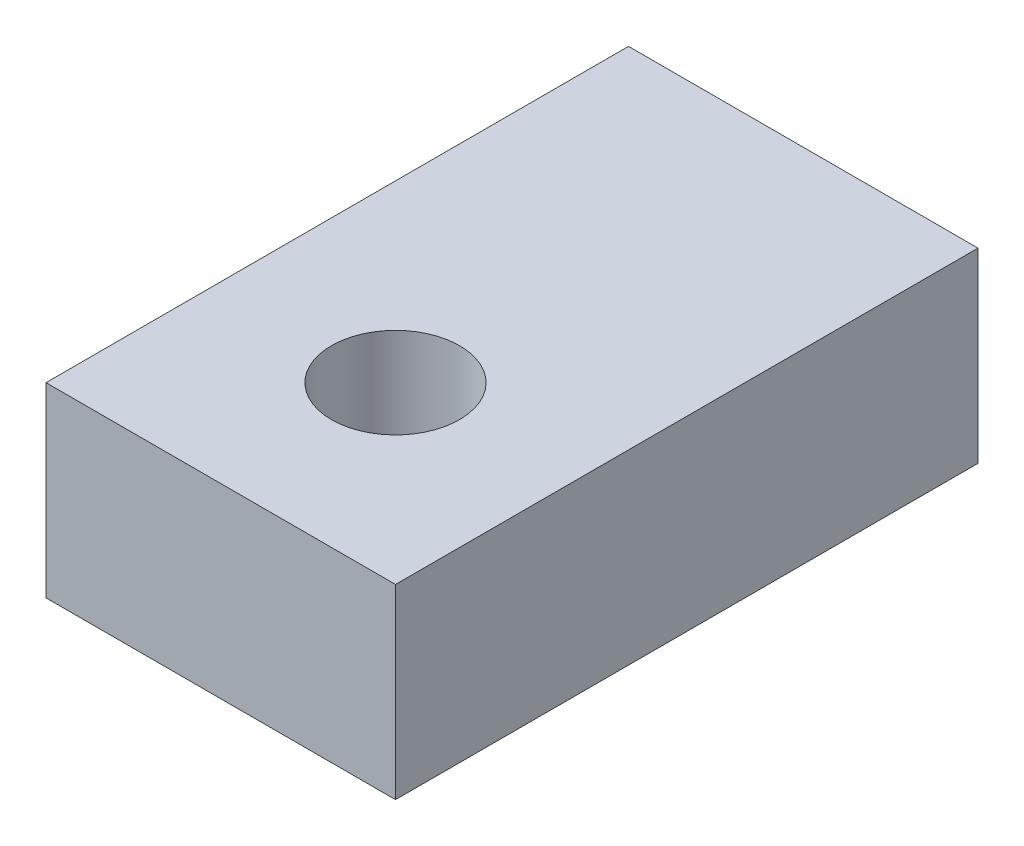
ISO-10303-21;
HEADER;
FILE_DESCRIPTION(('STEP AP214'),'2;1');
FILE_NAME('part.step','',(''),(''),'','','');
FILE_SCHEMA(('AUTOMOTIVE_DESIGN { 1 0 10303 214 1 1 1 1 }'));
ENDSEC;
DATA;
#1=APPLICATION_CONTEXT('core data for automotive mechanical design processes');
#2=APPLICATION_PROTOCOL_DEFINITION('international standard','automotive_design',2000,#1);
#3=PRODUCT_CONTEXT('',#1,'mechanical');
#4=PRODUCT('Part','Part','',(#3));
#5=PRODUCT_RELATED_PRODUCT_CATEGORY('part','',(#4));
#6=PRODUCT_DEFINITION_FORMATION('','',#4);
#7=PRODUCT_DEFINITION_CONTEXT('part definition',#1,'design');
#8=PRODUCT_DEFINITION('design','',#6,#7);
#9=PRODUCT_DEFINITION_SHAPE('','',#8);
#10=(LENGTH_UNIT() NAMED_UNIT(*) SI_UNIT(.MILLI.,.METRE.));
#11=(NAMED_UNIT(*) PLANE_ANGLE_UNIT() SI_UNIT($,.RADIAN.));
#12=(NAMED_UNIT(*) SI_UNIT($,.STERADIAN.) SOLID_ANGLE_UNIT());
#13=UNCERTAINTY_MEASURE_WITH_UNIT(LENGTH_MEASURE(1.E-05),#10,'distance_accuracy_value','');
#14=(GEOMETRIC_REPRESENTATION_CONTEXT(3) GLOBAL_UNCERTAINTY_ASSIGNED_CONTEXT((#13)) GLOBAL_UNIT_ASSIGNED_CONTEXT((#10,
#11,#12)) REPRESENTATION_CONTEXT('',''));
#15=CARTESIAN_POINT('',(0.,0.,0.));
#16=DIRECTION('',(0.,0.,1.));
#17=DIRECTION('',(1.,0.,0.));
#18=AXIS2_PLACEMENT_3D('',#15,#16,#17);
#19=CARTESIAN_POINT('',(-30.,32.,0.));
#20=DIRECTION('',(1.,0.,0.));
#21=DIRECTION('',(0.,0.,-1.));
#22=AXIS2_PLACEMENT_3D('',#19,#20,#21);
#23=PLANE('',#22);
#24=DIRECTION('',(0.,0.,1.));
#25=VECTOR('',#24,1.);
#26=CARTESIAN_POINT('',(-30.,0.,0.));
#27=LINE('',#26,#25);
#28=CARTESIAN_POINT('',(-30.,0.,0.));
#29=VERTEX_POINT('',#28);
#30=CARTESIAN_POINT('',(-30.,0.,100.));
#31=VERTEX_POINT('',#30);
#32=EDGE_CURVE('E99',#29,#31,#27,.T.);
#33=ORIENTED_EDGE('',*,*,#32,.T.);
#34=DIRECTION('',(0.,-1.,0.));
#35=VECTOR('',#34,1.);
#36=CARTESIAN_POINT('',(-30.,32.,100.));
#37=LINE('',#36,#35);
#38=CARTESIAN_POINT('',(-30.,32.,100.));
#39=VERTEX_POINT('',#38);
#40=EDGE_CURVE('E11',#39,#31,#37,.T.);
#41=ORIENTED_EDGE('',*,*,#40,.F.);
#42=DIRECTION('',(0.,0.,1.));
#43=VECTOR('',#42,1.);
#44=CARTESIAN_POINT('',(-30.,32.,0.));
#45=LINE('',#44,#43);
#46=CARTESIAN_POINT('',(-30.,32.,0.));
#47=VERTEX_POINT('',#46);
#48=EDGE_CURVE('E87',#47,#39,#45,.T.);
#49=ORIENTED_EDGE('',*,*,#48,.F.);
#50=DIRECTION('',(0.,-1.,0.));
#51=VECTOR('',#50,1.);
#52=CARTESIAN_POINT('',(-30.,32.,0.));
#53=LINE('',#52,#51);
#54=EDGE_CURVE('E95',#47,#29,#53,.T.);
#55=ORIENTED_EDGE('',*,*,#54,.T.);
#56=EDGE_LOOP('',(#33,#41,#49,#55));
#57=FACE_BOUND('',#56,.T.);
#58=ADVANCED_FACE('F36',(#57),#23,.F.);
#59=CARTESIAN_POINT('',(-30.,32.,100.));
#60=DIRECTION('',(0.,0.,-1.));
#61=DIRECTION('',(-1.,0.,0.));
#62=AXIS2_PLACEMENT_3D('',#59,#60,#61);
#63=PLANE('',#62);
#64=DIRECTION('',(1.,0.,0.));
#65=VECTOR('',#64,1.);
#66=CARTESIAN_POINT('',(-30.,0.,100.));
#67=LINE('',#66,#65);
#68=CARTESIAN_POINT('',(30.,0.,100.));
#69=VERTEX_POINT('',#68);
#70=EDGE_CURVE('E91',#31,#69,#67,.T.);
#71=ORIENTED_EDGE('',*,*,#70,.T.);
#72=DIRECTION('',(0.,-1.,0.));
#73=VECTOR('',#72,1.);
#74=CARTESIAN_POINT('',(30.,32.,100.));
#75=LINE('',#74,#73);
#76=CARTESIAN_POINT('',(30.,32.,100.));
#77=VERTEX_POINT('',#76);
#78=EDGE_CURVE('E44',#77,#69,#75,.T.);
#79=ORIENTED_EDGE('',*,*,#78,.F.);
#80=DIRECTION('',(1.,0.,0.));
#81=VECTOR('',#80,1.);
#82=CARTESIAN_POINT('',(-30.,32.,100.));
#83=LINE('',#82,#81);
#84=EDGE_CURVE('E82',#39,#77,#83,.T.);
#85=ORIENTED_EDGE('',*,*,#84,.F.);
#86=ORIENTED_EDGE('',*,*,#40,.T.);
#87=EDGE_LOOP('',(#71,#79,#85,#86));
#88=FACE_BOUND('',#87,.T.);
#89=ADVANCED_FACE('F90',(#88),#63,.F.);
#90=CARTESIAN_POINT('',(30.,32.,0.));
#91=DIRECTION('',(-1.,0.,0.));
#92=DIRECTION('',(0.,0.,1.));
#93=AXIS2_PLACEMENT_3D('',#90,#91,#92);
#94=PLANE('',#93);
#95=DIRECTION('',(0.,0.,-1.));
#96=VECTOR('',#95,1.);
#97=CARTESIAN_POINT('',(30.,0.,0.));
#98=LINE('',#97,#96);
#99=CARTESIAN_POINT('',(30.,0.,0.));
#100=VERTEX_POINT('',#99);
#101=EDGE_CURVE('E69',#69,#100,#98,.T.);
#102=ORIENTED_EDGE('',*,*,#101,.T.);
#103=DIRECTION('',(0.,-1.,0.));
#104=VECTOR('',#103,1.);
#105=CARTESIAN_POINT('',(30.,32.,0.));
#106=LINE('',#105,#104);
#107=CARTESIAN_POINT('',(30.,32.,0.));
#108=VERTEX_POINT('',#107);
#109=EDGE_CURVE('E92',#108,#100,#106,.T.);
#110=ORIENTED_EDGE('',*,*,#109,.F.);
#111=DIRECTION('',(0.,0.,-1.));
#112=VECTOR('',#111,1.);
#113=CARTESIAN_POINT('',(30.,32.,0.));
#114=LINE('',#113,#112);
#115=EDGE_CURVE('E85',#77,#108,#114,.T.);
#116=ORIENTED_EDGE('',*,*,#115,.F.);
#117=ORIENTED_EDGE('',*,*,#78,.T.);
#118=EDGE_LOOP('',(#102,#110,#116,#117));
#119=FACE_BOUND('',#118,.T.);
#120=ADVANCED_FACE('F93',(#119),#94,.F.);
#121=CARTESIAN_POINT('',(-30.,32.,0.));
#122=DIRECTION('',(0.,0.,1.));
#123=DIRECTION('',(1.,0.,0.));
#124=AXIS2_PLACEMENT_3D('',#121,#122,#123);
#125=PLANE('',#124);
#126=DIRECTION('',(-1.,0.,0.));
#127=VECTOR('',#126,1.);
#128=CARTESIAN_POINT('',(-30.,0.,0.));
#129=LINE('',#128,#127);
#130=EDGE_CURVE('E75',#100,#29,#129,.T.);
#131=ORIENTED_EDGE('',*,*,#130,.T.);
#132=ORIENTED_EDGE('',*,*,#54,.F.);
#133=DIRECTION('',(-1.,0.,0.));
#134=VECTOR('',#133,1.);
#135=CARTESIAN_POINT('',(-30.,32.,0.));
#136=LINE('',#135,#134);
#137=EDGE_CURVE('E52',#108,#47,#136,.T.);
#138=ORIENTED_EDGE('',*,*,#137,.F.);
#139=ORIENTED_EDGE('',*,*,#109,.T.);
#140=EDGE_LOOP('',(#131,#132,#138,#139));
#141=FACE_BOUND('',#140,.T.);
#142=ADVANCED_FACE('F107',(#141),#125,.F.);
#143=CARTESIAN_POINT('',(-30.,32.,100.));
#144=DIRECTION('',(0.,1.,0.));
#145=DIRECTION('',(0.,0.,1.));
#146=AXIS2_PLACEMENT_3D('',#143,#144,#145);
#147=PLANE('',#146);
#148=CARTESIAN_POINT('',(0.,32.,70.));
#149=DIRECTION('',(0.,1.,0.));
#150=DIRECTION('',(0.,0.,1.));
#151=AXIS2_PLACEMENT_3D('',#148,#149,#150);
#152=CIRCLE('',#151,11.);
#153=CARTESIAN_POINT('',(0.,32.,81.));
#154=VERTEX_POINT('',#153);
#155=EDGE_CURVE('E113',#154,#154,#152,.T.);
#156=ORIENTED_EDGE('',*,*,#155,.F.);
#157=EDGE_LOOP('',(#156));
#158=FACE_BOUND('',#157,.T.);
#159=ORIENTED_EDGE('',*,*,#48,.T.);
#160=ORIENTED_EDGE('',*,*,#84,.T.);
#161=ORIENTED_EDGE('',*,*,#115,.T.);
#162=ORIENTED_EDGE('',*,*,#137,.T.);
#163=EDGE_LOOP('',(#159,#160,#161,#162));
#164=FACE_BOUND('',#163,.T.);
#165=ADVANCED_FACE('F83',(#158,#164),#147,.T.);
#166=CARTESIAN_POINT('',(-30.,0.,100.));
#167=DIRECTION('',(0.,1.,0.));
#168=DIRECTION('',(0.,0.,1.));
#169=AXIS2_PLACEMENT_3D('',#166,#167,#168);
#170=PLANE('',#169);
#171=CARTESIAN_POINT('',(0.,0.,70.));
#172=DIRECTION('',(0.,1.,0.));
#173=DIRECTION('',(0.,0.,1.));
#174=AXIS2_PLACEMENT_3D('',#171,#172,#173);
#175=CIRCLE('',#174,11.);
#176=CARTESIAN_POINT('',(0.,0.,81.));
#177=VERTEX_POINT('',#176);
#178=EDGE_CURVE('E102',#177,#177,#175,.T.);
#179=ORIENTED_EDGE('',*,*,#178,.T.);
#180=EDGE_LOOP('',(#179));
#181=FACE_BOUND('',#180,.T.);
#182=ORIENTED_EDGE('',*,*,#32,.F.);
#183=ORIENTED_EDGE('',*,*,#130,.F.);
#184=ORIENTED_EDGE('',*,*,#101,.F.);
#185=ORIENTED_EDGE('',*,*,#70,.F.);
#186=EDGE_LOOP('',(#182,#183,#184,#185));
#187=FACE_BOUND('',#186,.T.);
#188=ADVANCED_FACE('F110',(#181,#187),#170,.F.);
#189=CARTESIAN_POINT('',(0.,0.,70.));
#190=DIRECTION('',(0.,1.,0.));
#191=DIRECTION('',(0.,0.,1.));
#192=AXIS2_PLACEMENT_3D('',#189,#190,#191);
#193=CYLINDRICAL_SURFACE('',#192,11.);
#194=ORIENTED_EDGE('',*,*,#178,.F.);
#195=EDGE_LOOP('',(#194));
#196=FACE_BOUND('',#195,.T.);
#197=ORIENTED_EDGE('',*,*,#155,.T.);
#198=EDGE_LOOP('',(#197));
#199=FACE_BOUND('',#198,.T.);
#200=ADVANCED_FACE('F120',(#196,#199),#193,.F.);
#201=CLOSED_SHELL('',(#58,#89,#120,#142,#165,#188,#200));
#202=MANIFOLD_SOLID_BREP('B2',#201);
#203=ADVANCED_BREP_SHAPE_REPRESENTATION('',(#18,#202),#14);
#204=SHAPE_DEFINITION_REPRESENTATION(#9,#203);
ENDSEC;
END-ISO-10303-21;
